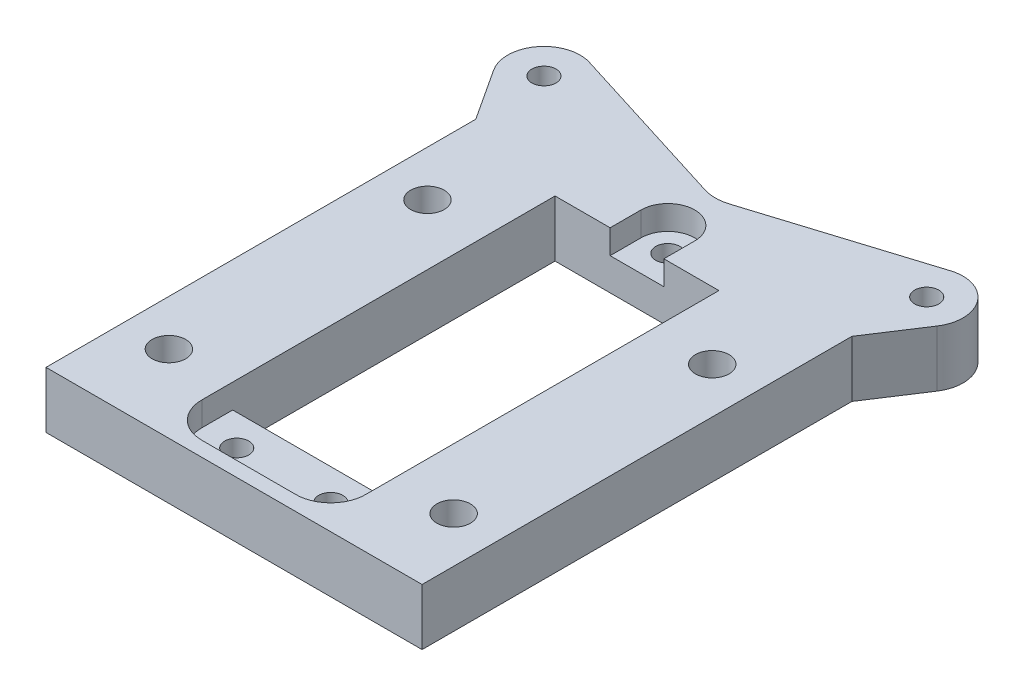
ISO-10303-21;
HEADER;
FILE_DESCRIPTION(('STEP AP214'),'2;1');
FILE_NAME('part.step','',(''),(''),'','','');
FILE_SCHEMA(('AUTOMOTIVE_DESIGN { 1 0 10303 214 1 1 1 1 }'));
ENDSEC;
DATA;
#1=APPLICATION_CONTEXT('core data for automotive mechanical design processes');
#2=APPLICATION_PROTOCOL_DEFINITION('international standard','automotive_design',2000,#1);
#3=PRODUCT_CONTEXT('',#1,'mechanical');
#4=PRODUCT('Part','Part','',(#3));
#5=PRODUCT_RELATED_PRODUCT_CATEGORY('part','',(#4));
#6=PRODUCT_DEFINITION_FORMATION('','',#4);
#7=PRODUCT_DEFINITION_CONTEXT('part definition',#1,'design');
#8=PRODUCT_DEFINITION('design','',#6,#7);
#9=PRODUCT_DEFINITION_SHAPE('','',#8);
#10=(LENGTH_UNIT() NAMED_UNIT(*) SI_UNIT(.MILLI.,.METRE.));
#11=(NAMED_UNIT(*) PLANE_ANGLE_UNIT() SI_UNIT($,.RADIAN.));
#12=(NAMED_UNIT(*) SI_UNIT($,.STERADIAN.) SOLID_ANGLE_UNIT());
#13=UNCERTAINTY_MEASURE_WITH_UNIT(LENGTH_MEASURE(1.E-05),#10,'distance_accuracy_value','');
#14=(GEOMETRIC_REPRESENTATION_CONTEXT(3) GLOBAL_UNCERTAINTY_ASSIGNED_CONTEXT((#13)) GLOBAL_UNIT_ASSIGNED_CONTEXT((#10,
#11,#12)) REPRESENTATION_CONTEXT('',''));
#15=CARTESIAN_POINT('',(0.,0.,0.));
#16=DIRECTION('',(0.,0.,1.));
#17=DIRECTION('',(1.,0.,0.));
#18=AXIS2_PLACEMENT_3D('',#15,#16,#17);
#19=CARTESIAN_POINT('',(-6.1,4.2,12.));
#20=DIRECTION('',(0.,0.,-1.));
#21=DIRECTION('',(-1.,0.,0.));
#22=AXIS2_PLACEMENT_3D('',#19,#20,#21);
#23=PLANE('',#22);
#24=DIRECTION('',(0.,-1.,0.));
#25=VECTOR('',#24,1.);
#26=CARTESIAN_POINT('',(-6.1,4.2,12.));
#27=LINE('',#26,#25);
#28=CARTESIAN_POINT('',(-6.1,2.4,12.));
#29=VERTEX_POINT('',#28);
#30=CARTESIAN_POINT('',(-6.1,0.,12.));
#31=VERTEX_POINT('',#30);
#32=EDGE_CURVE('E313',#29,#31,#27,.T.);
#33=ORIENTED_EDGE('',*,*,#32,.F.);
#34=DIRECTION('',(-1.,0.,0.));
#35=VECTOR('',#34,1.);
#36=CARTESIAN_POINT('',(6.10000000000001,2.4,12.));
#37=LINE('',#36,#35);
#38=CARTESIAN_POINT('',(6.10000000000001,2.4,12.));
#39=VERTEX_POINT('',#38);
#40=EDGE_CURVE('E61',#39,#29,#37,.T.);
#41=ORIENTED_EDGE('',*,*,#40,.F.);
#42=DIRECTION('',(0.,-1.,0.));
#43=VECTOR('',#42,1.);
#44=CARTESIAN_POINT('',(6.10000000000001,4.2,12.));
#45=LINE('',#44,#43);
#46=CARTESIAN_POINT('',(6.10000000000001,0.,12.));
#47=VERTEX_POINT('',#46);
#48=EDGE_CURVE('E329',#39,#47,#45,.T.);
#49=ORIENTED_EDGE('',*,*,#48,.T.);
#50=DIRECTION('',(1.,0.,0.));
#51=VECTOR('',#50,1.);
#52=CARTESIAN_POINT('',(-6.1,0.,12.));
#53=LINE('',#52,#51);
#54=EDGE_CURVE('E301',#31,#47,#53,.T.);
#55=ORIENTED_EDGE('',*,*,#54,.F.);
#56=EDGE_LOOP('',(#33,#41,#49,#55));
#57=FACE_BOUND('',#56,.T.);
#58=ADVANCED_FACE('F36',(#57),#23,.T.);
#59=CARTESIAN_POINT('',(-3.5,4.2,14.3));
#60=DIRECTION('',(0.,-1.,0.));
#61=DIRECTION('',(0.,0.,-1.));
#62=AXIS2_PLACEMENT_3D('',#59,#60,#61);
#63=CYLINDRICAL_SURFACE('',#62,0.9);
#64=CARTESIAN_POINT('',(-3.5,0.,14.3));
#65=DIRECTION('',(0.,1.,0.));
#66=DIRECTION('',(0.,0.,1.));
#67=AXIS2_PLACEMENT_3D('',#64,#65,#66);
#68=CIRCLE('',#67,0.9);
#69=CARTESIAN_POINT('',(-3.5,0.,15.2));
#70=VERTEX_POINT('',#69);
#71=EDGE_CURVE('E288',#70,#70,#68,.T.);
#72=ORIENTED_EDGE('',*,*,#71,.F.);
#73=EDGE_LOOP('',(#72));
#74=FACE_BOUND('',#73,.T.);
#75=CARTESIAN_POINT('',(-3.5,2.4,14.3));
#76=DIRECTION('',(0.,1.,0.));
#77=DIRECTION('',(0.,0.,1.));
#78=AXIS2_PLACEMENT_3D('',#75,#76,#77);
#79=CIRCLE('',#78,0.9);
#80=CARTESIAN_POINT('',(-3.5,2.4,15.2));
#81=VERTEX_POINT('',#80);
#82=EDGE_CURVE('E255',#81,#81,#79,.T.);
#83=ORIENTED_EDGE('',*,*,#82,.T.);
#84=EDGE_LOOP('',(#83));
#85=FACE_BOUND('',#84,.T.);
#86=ADVANCED_FACE('F423',(#74,#85),#63,.F.);
#87=CARTESIAN_POINT('',(3.5,4.2,14.3));
#88=DIRECTION('',(0.,-1.,0.));
#89=DIRECTION('',(0.,0.,-1.));
#90=AXIS2_PLACEMENT_3D('',#87,#88,#89);
#91=CYLINDRICAL_SURFACE('',#90,0.899999999999999);
#92=CARTESIAN_POINT('',(3.5,0.,14.3));
#93=DIRECTION('',(0.,1.,0.));
#94=DIRECTION('',(0.,0.,1.));
#95=AXIS2_PLACEMENT_3D('',#92,#93,#94);
#96=CIRCLE('',#95,0.899999999999999);
#97=CARTESIAN_POINT('',(3.5,0.,15.2));
#98=VERTEX_POINT('',#97);
#99=EDGE_CURVE('E283',#98,#98,#96,.T.);
#100=ORIENTED_EDGE('',*,*,#99,.F.);
#101=EDGE_LOOP('',(#100));
#102=FACE_BOUND('',#101,.T.);
#103=CARTESIAN_POINT('',(3.5,2.4,14.3));
#104=DIRECTION('',(0.,1.,0.));
#105=DIRECTION('',(0.,0.,1.));
#106=AXIS2_PLACEMENT_3D('',#103,#104,#105);
#107=CIRCLE('',#106,0.899999999999999);
#108=CARTESIAN_POINT('',(3.5,2.4,15.2));
#109=VERTEX_POINT('',#108);
#110=EDGE_CURVE('E40',#109,#109,#107,.T.);
#111=ORIENTED_EDGE('',*,*,#110,.T.);
#112=EDGE_LOOP('',(#111));
#113=FACE_BOUND('',#112,.T.);
#114=ADVANCED_FACE('F406',(#102,#113),#91,.F.);
#115=CARTESIAN_POINT('',(14.25,4.2,-19.3204851234516));
#116=DIRECTION('',(0.,1.,0.));
#117=DIRECTION('',(0.,0.,1.));
#118=AXIS2_PLACEMENT_3D('',#115,#116,#117);
#119=PLANE('',#118);
#120=DIRECTION('',(0.,0.,-1.));
#121=VECTOR('',#120,1.);
#122=CARTESIAN_POINT('',(2.,4.2,-12.));
#123=LINE('',#122,#121);
#124=CARTESIAN_POINT('',(2.,4.2,-12.));
#125=VERTEX_POINT('',#124);
#126=CARTESIAN_POINT('',(2.,4.2,-14.3));
#127=VERTEX_POINT('',#126);
#128=EDGE_CURVE('E206',#125,#127,#123,.T.);
#129=ORIENTED_EDGE('',*,*,#128,.F.);
#130=DIRECTION('',(-1.,0.,0.));
#131=VECTOR('',#130,1.);
#132=CARTESIAN_POINT('',(6.1,4.2,-12.));
#133=LINE('',#132,#131);
#134=CARTESIAN_POINT('',(6.1,4.2,-12.));
#135=VERTEX_POINT('',#134);
#136=EDGE_CURVE('E308',#135,#125,#133,.T.);
#137=ORIENTED_EDGE('',*,*,#136,.F.);
#138=DIRECTION('',(0.,0.,-1.));
#139=VECTOR('',#138,1.);
#140=CARTESIAN_POINT('',(6.10000000000001,4.2,12.));
#141=LINE('',#140,#139);
#142=CARTESIAN_POINT('',(6.1,4.2,14.3));
#143=VERTEX_POINT('',#142);
#144=EDGE_CURVE('E304',#143,#135,#141,.T.);
#145=ORIENTED_EDGE('',*,*,#144,.F.);
#146=CARTESIAN_POINT('',(3.5,4.2,14.3));
#147=DIRECTION('',(0.,1.,0.));
#148=DIRECTION('',(0.,0.,-1.));
#149=AXIS2_PLACEMENT_3D('',#146,#147,#148);
#150=CIRCLE('',#149,2.6);
#151=CARTESIAN_POINT('',(3.5,4.2,16.9));
#152=VERTEX_POINT('',#151);
#153=EDGE_CURVE('E225',#152,#143,#150,.T.);
#154=ORIENTED_EDGE('',*,*,#153,.F.);
#155=DIRECTION('',(1.,0.,0.));
#156=VECTOR('',#155,1.);
#157=CARTESIAN_POINT('',(-3.5,4.2,16.9));
#158=LINE('',#157,#156);
#159=CARTESIAN_POINT('',(-3.5,4.2,16.9));
#160=VERTEX_POINT('',#159);
#161=EDGE_CURVE('E242',#160,#152,#158,.T.);
#162=ORIENTED_EDGE('',*,*,#161,.F.);
#163=CARTESIAN_POINT('',(-3.5,4.2,14.3));
#164=DIRECTION('',(0.,1.,0.));
#165=DIRECTION('',(0.,0.,1.));
#166=AXIS2_PLACEMENT_3D('',#163,#164,#165);
#167=CIRCLE('',#166,2.6);
#168=CARTESIAN_POINT('',(-6.1,4.2,14.3));
#169=VERTEX_POINT('',#168);
#170=EDGE_CURVE('E239',#169,#160,#167,.T.);
#171=ORIENTED_EDGE('',*,*,#170,.F.);
#172=DIRECTION('',(0.,0.,1.));
#173=VECTOR('',#172,1.);
#174=CARTESIAN_POINT('',(-6.09999999999999,4.2,-12.));
#175=LINE('',#174,#173);
#176=CARTESIAN_POINT('',(-6.09999999999999,4.2,-12.));
#177=VERTEX_POINT('',#176);
#178=EDGE_CURVE('E311',#177,#169,#175,.T.);
#179=ORIENTED_EDGE('',*,*,#178,.F.);
#180=CARTESIAN_POINT('',(-2.,4.2,-12.));
#181=VERTEX_POINT('',#180);
#182=EDGE_CURVE('E306',#181,#177,#133,.T.);
#183=ORIENTED_EDGE('',*,*,#182,.F.);
#184=DIRECTION('',(0.,0.,1.));
#185=VECTOR('',#184,1.);
#186=CARTESIAN_POINT('',(-2.,4.2,-14.3));
#187=LINE('',#186,#185);
#188=CARTESIAN_POINT('',(-2.,4.2,-14.3));
#189=VERTEX_POINT('',#188);
#190=EDGE_CURVE('E209',#189,#181,#187,.T.);
#191=ORIENTED_EDGE('',*,*,#190,.F.);
#192=CARTESIAN_POINT('',(0.,4.2,-14.3));
#193=DIRECTION('',(0.,1.,0.));
#194=DIRECTION('',(0.,0.,-1.));
#195=AXIS2_PLACEMENT_3D('',#192,#193,#194);
#196=CIRCLE('',#195,2.);
#197=EDGE_CURVE('E193',#127,#189,#196,.T.);
#198=ORIENTED_EDGE('',*,*,#197,.F.);
#199=EDGE_LOOP('',(#129,#137,#145,#154,#162,#171,#179,#183,#191,#198));
#200=FACE_BOUND('',#199,.T.);
#201=CARTESIAN_POINT('',(-14.25,4.2,-19.3204851234516));
#202=DIRECTION('',(0.,1.,0.));
#203=DIRECTION('',(0.,0.,1.));
#204=AXIS2_PLACEMENT_3D('',#201,#202,#203);
#205=CIRCLE('',#204,0.900000000000001);
#206=CARTESIAN_POINT('',(-14.25,4.2,-18.4204851234516));
#207=VERTEX_POINT('',#206);
#208=EDGE_CURVE('E265',#207,#207,#205,.T.);
#209=ORIENTED_EDGE('',*,*,#208,.F.);
#210=EDGE_LOOP('',(#209));
#211=FACE_BOUND('',#210,.T.);
#212=CARTESIAN_POINT('',(10.6,4.2,-7.));
#213=DIRECTION('',(0.,1.,0.));
#214=DIRECTION('',(0.,0.,1.));
#215=AXIS2_PLACEMENT_3D('',#212,#213,#214);
#216=CIRCLE('',#215,1.25);
#217=CARTESIAN_POINT('',(10.6,4.2,-5.75));
#218=VERTEX_POINT('',#217);
#219=EDGE_CURVE('E274',#218,#218,#216,.T.);
#220=ORIENTED_EDGE('',*,*,#219,.F.);
#221=EDGE_LOOP('',(#220));
#222=FACE_BOUND('',#221,.T.);
#223=CARTESIAN_POINT('',(-10.6,4.2,12.25));
#224=DIRECTION('',(0.,1.,0.));
#225=DIRECTION('',(0.,0.,1.));
#226=AXIS2_PLACEMENT_3D('',#223,#224,#225);
#227=CIRCLE('',#226,1.25);
#228=CARTESIAN_POINT('',(-10.6,4.2,13.5));
#229=VERTEX_POINT('',#228);
#230=EDGE_CURVE('E292',#229,#229,#227,.T.);
#231=ORIENTED_EDGE('',*,*,#230,.F.);
#232=EDGE_LOOP('',(#231));
#233=FACE_BOUND('',#232,.T.);
#234=DIRECTION('',(1.,0.,0.));
#235=VECTOR('',#234,1.);
#236=CARTESIAN_POINT('',(-14.,4.2,18.));
#237=LINE('',#236,#235);
#238=CARTESIAN_POINT('',(-14.,4.2,18.));
#239=VERTEX_POINT('',#238);
#240=CARTESIAN_POINT('',(14.,4.2,18.));
#241=VERTEX_POINT('',#240);
#242=EDGE_CURVE('E332',#239,#241,#237,.T.);
#243=ORIENTED_EDGE('',*,*,#242,.T.);
#244=DIRECTION('',(0.,0.,-1.));
#245=VECTOR('',#244,1.);
#246=CARTESIAN_POINT('',(14.,4.2,18.));
#247=LINE('',#246,#245);
#248=CARTESIAN_POINT('',(14.,4.2,-14.));
#249=VERTEX_POINT('',#248);
#250=EDGE_CURVE('E335',#241,#249,#247,.T.);
#251=ORIENTED_EDGE('',*,*,#250,.T.);
#252=DIRECTION('',(0.546813594421689,0.,-0.837254377686753));
#253=VECTOR('',#252,1.);
#254=CARTESIAN_POINT('',(14.,4.2,-14.));
#255=LINE('',#254,#253);
#256=CARTESIAN_POINT('',(16.5105868197542,4.2,-17.844088418513));
#257=VERTEX_POINT('',#256);
#258=EDGE_CURVE('E338',#249,#257,#255,.T.);
#259=ORIENTED_EDGE('',*,*,#258,.T.);
#260=CARTESIAN_POINT('',(14.25,4.2,-19.3204851234516));
#261=DIRECTION('',(0.,1.,0.));
#262=DIRECTION('',(0.,0.,1.));
#263=AXIS2_PLACEMENT_3D('',#260,#261,#262);
#264=CIRCLE('',#263,2.7);
#265=CARTESIAN_POINT('',(13.3796995546005,4.2,-21.8763757969229));
#266=VERTEX_POINT('',#265);
#267=EDGE_CURVE('E340',#257,#266,#264,.T.);
#268=ORIENTED_EDGE('',*,*,#267,.T.);
#269=DIRECTION('',(-0.954392340765674,0.,0.298555287824245));
#270=VECTOR('',#269,1.);
#271=CARTESIAN_POINT('',(13.3796995546005,4.2,-21.8763757969229));
#272=LINE('',#271,#270);
#273=CARTESIAN_POINT('',(0.895665863472729,4.2,-17.9710906089969));
#274=VERTEX_POINT('',#273);
#275=EDGE_CURVE('E342',#266,#274,#272,.T.);
#276=ORIENTED_EDGE('',*,*,#275,.T.);
#277=CARTESIAN_POINT('',(0.,4.2,-20.8342676312939));
#278=DIRECTION('',(0.,1.,0.));
#279=DIRECTION('',(0.,0.,1.));
#280=AXIS2_PLACEMENT_3D('',#277,#278,#279);
#281=CIRCLE('',#280,3.);
#282=CARTESIAN_POINT('',(-0.895665863472739,4.2,-17.9710906089969));
#283=VERTEX_POINT('',#282);
#284=EDGE_CURVE('E11',#274,#283,#281,.F.);
#285=ORIENTED_EDGE('',*,*,#284,.T.);
#286=DIRECTION('',(-0.954392340765674,0.,-0.298555287824245));
#287=VECTOR('',#286,1.);
#288=CARTESIAN_POINT('',(0.,4.2,-17.690906277835));
#289=LINE('',#288,#287);
#290=CARTESIAN_POINT('',(-13.3796995546005,4.2,-21.8763757969229));
#291=VERTEX_POINT('',#290);
#292=EDGE_CURVE('E345',#283,#291,#289,.T.);
#293=ORIENTED_EDGE('',*,*,#292,.T.);
#294=CARTESIAN_POINT('',(-14.25,4.2,-19.3204851234516));
#295=DIRECTION('',(0.,1.,0.));
#296=DIRECTION('',(0.,0.,1.));
#297=AXIS2_PLACEMENT_3D('',#294,#295,#296);
#298=CIRCLE('',#297,2.7);
#299=CARTESIAN_POINT('',(-16.5105868197542,4.2,-17.844088418513));
#300=VERTEX_POINT('',#299);
#301=EDGE_CURVE('E347',#291,#300,#298,.T.);
#302=ORIENTED_EDGE('',*,*,#301,.T.);
#303=DIRECTION('',(0.546813594421689,0.,0.837254377686753));
#304=VECTOR('',#303,1.);
#305=CARTESIAN_POINT('',(-16.5105868197542,4.2,-17.844088418513));
#306=LINE('',#305,#304);
#307=CARTESIAN_POINT('',(-14.,4.2,-14.));
#308=VERTEX_POINT('',#307);
#309=EDGE_CURVE('E349',#300,#308,#306,.T.);
#310=ORIENTED_EDGE('',*,*,#309,.T.);
#311=DIRECTION('',(0.,0.,1.));
#312=VECTOR('',#311,1.);
#313=CARTESIAN_POINT('',(-14.,4.2,-14.));
#314=LINE('',#313,#312);
#315=EDGE_CURVE('E351',#308,#239,#314,.T.);
#316=ORIENTED_EDGE('',*,*,#315,.T.);
#317=EDGE_LOOP('',(#243,#251,#259,#268,#276,#285,#293,#302,#310,#316));
#318=FACE_BOUND('',#317,.T.);
#319=CARTESIAN_POINT('',(-10.6,4.2,-7.));
#320=DIRECTION('',(0.,1.,0.));
#321=DIRECTION('',(0.,0.,1.));
#322=AXIS2_PLACEMENT_3D('',#319,#320,#321);
#323=CIRCLE('',#322,1.25);
#324=CARTESIAN_POINT('',(-10.6,4.2,-5.75));
#325=VERTEX_POINT('',#324);
#326=EDGE_CURVE('E298',#325,#325,#323,.T.);
#327=ORIENTED_EDGE('',*,*,#326,.F.);
#328=EDGE_LOOP('',(#327));
#329=FACE_BOUND('',#328,.T.);
#330=CARTESIAN_POINT('',(10.6,4.2,12.25));
#331=DIRECTION('',(0.,1.,0.));
#332=DIRECTION('',(0.,0.,1.));
#333=AXIS2_PLACEMENT_3D('',#330,#331,#332);
#334=CIRCLE('',#333,1.25);
#335=CARTESIAN_POINT('',(10.6,4.2,13.5));
#336=VERTEX_POINT('',#335);
#337=EDGE_CURVE('E280',#336,#336,#334,.T.);
#338=ORIENTED_EDGE('',*,*,#337,.F.);
#339=EDGE_LOOP('',(#338));
#340=FACE_BOUND('',#339,.T.);
#341=CARTESIAN_POINT('',(14.25,4.2,-19.3204851234516));
#342=DIRECTION('',(0.,1.,0.));
#343=DIRECTION('',(0.,0.,1.));
#344=AXIS2_PLACEMENT_3D('',#341,#342,#343);
#345=CIRCLE('',#344,0.900000000000001);
#346=CARTESIAN_POINT('',(14.25,4.2,-18.4204851234516));
#347=VERTEX_POINT('',#346);
#348=EDGE_CURVE('E259',#347,#347,#345,.T.);
#349=ORIENTED_EDGE('',*,*,#348,.F.);
#350=EDGE_LOOP('',(#349));
#351=FACE_BOUND('',#350,.T.);
#352=ADVANCED_FACE('F436',(#200,#211,#222,#233,#318,#329,#340,#351),#119,.T.);
#353=CARTESIAN_POINT('',(14.25,0.,-19.3204851234516));
#354=DIRECTION('',(0.,1.,0.));
#355=DIRECTION('',(0.,0.,1.));
#356=AXIS2_PLACEMENT_3D('',#353,#354,#355);
#357=PLANE('',#356);
#358=DIRECTION('',(1.,0.,0.));
#359=VECTOR('',#358,1.);
#360=CARTESIAN_POINT('',(-14.,0.,18.));
#361=LINE('',#360,#359);
#362=CARTESIAN_POINT('',(-14.,0.,18.));
#363=VERTEX_POINT('',#362);
#364=CARTESIAN_POINT('',(14.,0.,18.));
#365=VERTEX_POINT('',#364);
#366=EDGE_CURVE('E331',#363,#365,#361,.T.);
#367=ORIENTED_EDGE('',*,*,#366,.F.);
#368=DIRECTION('',(0.,0.,1.));
#369=VECTOR('',#368,1.);
#370=CARTESIAN_POINT('',(-14.,0.,-14.));
#371=LINE('',#370,#369);
#372=CARTESIAN_POINT('',(-14.,0.,-14.));
#373=VERTEX_POINT('',#372);
#374=EDGE_CURVE('E336',#373,#363,#371,.T.);
#375=ORIENTED_EDGE('',*,*,#374,.F.);
#376=DIRECTION('',(0.546813594421689,0.,0.837254377686753));
#377=VECTOR('',#376,1.);
#378=CARTESIAN_POINT('',(-16.5105868197542,0.,-17.844088418513));
#379=LINE('',#378,#377);
#380=CARTESIAN_POINT('',(-16.5105868197542,0.,-17.844088418513));
#381=VERTEX_POINT('',#380);
#382=EDGE_CURVE('E369',#381,#373,#379,.T.);
#383=ORIENTED_EDGE('',*,*,#382,.F.);
#384=CARTESIAN_POINT('',(-14.25,0.,-19.3204851234516));
#385=DIRECTION('',(0.,1.,0.));
#386=DIRECTION('',(0.,0.,1.));
#387=AXIS2_PLACEMENT_3D('',#384,#385,#386);
#388=CIRCLE('',#387,2.7);
#389=CARTESIAN_POINT('',(-13.3796995546005,0.,-21.8763757969229));
#390=VERTEX_POINT('',#389);
#391=EDGE_CURVE('E367',#390,#381,#388,.T.);
#392=ORIENTED_EDGE('',*,*,#391,.F.);
#393=DIRECTION('',(-0.954392340765674,0.,-0.298555287824245));
#394=VECTOR('',#393,1.);
#395=CARTESIAN_POINT('',(0.,0.,-17.690906277835));
#396=LINE('',#395,#394);
#397=CARTESIAN_POINT('',(-0.895665863472739,0.,-17.9710906089969));
#398=VERTEX_POINT('',#397);
#399=EDGE_CURVE('E365',#398,#390,#396,.T.);
#400=ORIENTED_EDGE('',*,*,#399,.F.);
#401=CARTESIAN_POINT('',(0.,0.,-20.8342676312939));
#402=DIRECTION('',(0.,1.,0.));
#403=DIRECTION('',(0.,0.,1.));
#404=AXIS2_PLACEMENT_3D('',#401,#402,#403);
#405=CIRCLE('',#404,3.);
#406=CARTESIAN_POINT('',(0.895665863472729,0.,-17.9710906089969));
#407=VERTEX_POINT('',#406);
#408=EDGE_CURVE('E45',#398,#407,#405,.T.);
#409=ORIENTED_EDGE('',*,*,#408,.T.);
#410=DIRECTION('',(-0.954392340765674,0.,0.298555287824245));
#411=VECTOR('',#410,1.);
#412=CARTESIAN_POINT('',(13.3796995546005,0.,-21.8763757969229));
#413=LINE('',#412,#411);
#414=CARTESIAN_POINT('',(13.3796995546005,0.,-21.8763757969229));
#415=VERTEX_POINT('',#414);
#416=EDGE_CURVE('E362',#415,#407,#413,.T.);
#417=ORIENTED_EDGE('',*,*,#416,.F.);
#418=CARTESIAN_POINT('',(14.25,0.,-19.3204851234516));
#419=DIRECTION('',(0.,1.,0.));
#420=DIRECTION('',(0.,0.,1.));
#421=AXIS2_PLACEMENT_3D('',#418,#419,#420);
#422=CIRCLE('',#421,2.7);
#423=CARTESIAN_POINT('',(16.5105868197542,0.,-17.844088418513));
#424=VERTEX_POINT('',#423);
#425=EDGE_CURVE('E360',#424,#415,#422,.T.);
#426=ORIENTED_EDGE('',*,*,#425,.F.);
#427=DIRECTION('',(0.546813594421689,0.,-0.837254377686753));
#428=VECTOR('',#427,1.);
#429=CARTESIAN_POINT('',(14.,0.,-14.));
#430=LINE('',#429,#428);
#431=CARTESIAN_POINT('',(14.,0.,-14.));
#432=VERTEX_POINT('',#431);
#433=EDGE_CURVE('E358',#432,#424,#430,.T.);
#434=ORIENTED_EDGE('',*,*,#433,.F.);
#435=DIRECTION('',(0.,0.,-1.));
#436=VECTOR('',#435,1.);
#437=CARTESIAN_POINT('',(14.,0.,18.));
#438=LINE('',#437,#436);
#439=EDGE_CURVE('E356',#365,#432,#438,.T.);
#440=ORIENTED_EDGE('',*,*,#439,.F.);
#441=EDGE_LOOP('',(#367,#375,#383,#392,#400,#409,#417,#426,#434,#440));
#442=FACE_BOUND('',#441,.T.);
#443=ORIENTED_EDGE('',*,*,#54,.T.);
#444=DIRECTION('',(0.,0.,-1.));
#445=VECTOR('',#444,1.);
#446=CARTESIAN_POINT('',(6.10000000000001,0.,12.));
#447=LINE('',#446,#445);
#448=CARTESIAN_POINT('',(6.1,0.,-12.));
#449=VERTEX_POINT('',#448);
#450=EDGE_CURVE('E316',#47,#449,#447,.T.);
#451=ORIENTED_EDGE('',*,*,#450,.T.);
#452=DIRECTION('',(-1.,0.,0.));
#453=VECTOR('',#452,1.);
#454=CARTESIAN_POINT('',(6.1,0.,-12.));
#455=LINE('',#454,#453);
#456=CARTESIAN_POINT('',(-6.09999999999999,0.,-12.));
#457=VERTEX_POINT('',#456);
#458=EDGE_CURVE('E319',#449,#457,#455,.T.);
#459=ORIENTED_EDGE('',*,*,#458,.T.);
#460=DIRECTION('',(0.,0.,1.));
#461=VECTOR('',#460,1.);
#462=CARTESIAN_POINT('',(-6.09999999999999,0.,-12.));
#463=LINE('',#462,#461);
#464=EDGE_CURVE('E307',#457,#31,#463,.T.);
#465=ORIENTED_EDGE('',*,*,#464,.T.);
#466=EDGE_LOOP('',(#443,#451,#459,#465));
#467=FACE_BOUND('',#466,.T.);
#468=CARTESIAN_POINT('',(-10.6,0.,-7.));
#469=DIRECTION('',(0.,1.,0.));
#470=DIRECTION('',(0.,0.,1.));
#471=AXIS2_PLACEMENT_3D('',#468,#469,#470);
#472=CIRCLE('',#471,1.25);
#473=CARTESIAN_POINT('',(-10.6,0.,-5.75));
#474=VERTEX_POINT('',#473);
#475=EDGE_CURVE('E295',#474,#474,#472,.T.);
#476=ORIENTED_EDGE('',*,*,#475,.T.);
#477=EDGE_LOOP('',(#476));
#478=FACE_BOUND('',#477,.T.);
#479=CARTESIAN_POINT('',(-10.6,0.,12.25));
#480=DIRECTION('',(0.,1.,0.));
#481=DIRECTION('',(0.,0.,1.));
#482=AXIS2_PLACEMENT_3D('',#479,#480,#481);
#483=CIRCLE('',#482,1.25);
#484=CARTESIAN_POINT('',(-10.6,0.,13.5));
#485=VERTEX_POINT('',#484);
#486=EDGE_CURVE('E291',#485,#485,#483,.T.);
#487=ORIENTED_EDGE('',*,*,#486,.T.);
#488=EDGE_LOOP('',(#487));
#489=FACE_BOUND('',#488,.T.);
#490=ORIENTED_EDGE('',*,*,#71,.T.);
#491=EDGE_LOOP('',(#490));
#492=FACE_BOUND('',#491,.T.);
#493=ORIENTED_EDGE('',*,*,#99,.T.);
#494=EDGE_LOOP('',(#493));
#495=FACE_BOUND('',#494,.T.);
#496=CARTESIAN_POINT('',(10.6,0.,12.25));
#497=DIRECTION('',(0.,1.,0.));
#498=DIRECTION('',(0.,0.,1.));
#499=AXIS2_PLACEMENT_3D('',#496,#497,#498);
#500=CIRCLE('',#499,1.25);
#501=CARTESIAN_POINT('',(10.6,0.,13.5));
#502=VERTEX_POINT('',#501);
#503=EDGE_CURVE('E277',#502,#502,#500,.T.);
#504=ORIENTED_EDGE('',*,*,#503,.T.);
#505=EDGE_LOOP('',(#504));
#506=FACE_BOUND('',#505,.T.);
#507=CARTESIAN_POINT('',(10.6,0.,-7.));
#508=DIRECTION('',(0.,1.,0.));
#509=DIRECTION('',(0.,0.,1.));
#510=AXIS2_PLACEMENT_3D('',#507,#508,#509);
#511=CIRCLE('',#510,1.25);
#512=CARTESIAN_POINT('',(10.6,0.,-5.75));
#513=VERTEX_POINT('',#512);
#514=EDGE_CURVE('E273',#513,#513,#511,.T.);
#515=ORIENTED_EDGE('',*,*,#514,.T.);
#516=EDGE_LOOP('',(#515));
#517=FACE_BOUND('',#516,.T.);
#518=CARTESIAN_POINT('',(0.,0.,-14.3));
#519=DIRECTION('',(0.,1.,0.));
#520=DIRECTION('',(0.,0.,1.));
#521=AXIS2_PLACEMENT_3D('',#518,#519,#520);
#522=CIRCLE('',#521,0.9);
#523=CARTESIAN_POINT('',(0.,0.,-13.4));
#524=VERTEX_POINT('',#523);
#525=EDGE_CURVE('E268',#524,#524,#522,.T.);
#526=ORIENTED_EDGE('',*,*,#525,.T.);
#527=EDGE_LOOP('',(#526));
#528=FACE_BOUND('',#527,.T.);
#529=CARTESIAN_POINT('',(-14.25,0.,-19.3204851234516));
#530=DIRECTION('',(0.,1.,0.));
#531=DIRECTION('',(0.,0.,1.));
#532=AXIS2_PLACEMENT_3D('',#529,#530,#531);
#533=CIRCLE('',#532,0.900000000000001);
#534=CARTESIAN_POINT('',(-14.25,0.,-18.4204851234516));
#535=VERTEX_POINT('',#534);
#536=EDGE_CURVE('E262',#535,#535,#533,.T.);
#537=ORIENTED_EDGE('',*,*,#536,.T.);
#538=EDGE_LOOP('',(#537));
#539=FACE_BOUND('',#538,.T.);
#540=CARTESIAN_POINT('',(14.25,0.,-19.3204851234516));
#541=DIRECTION('',(0.,1.,0.));
#542=DIRECTION('',(0.,0.,1.));
#543=AXIS2_PLACEMENT_3D('',#540,#541,#542);
#544=CIRCLE('',#543,0.900000000000001);
#545=CARTESIAN_POINT('',(14.25,0.,-18.4204851234516));
#546=VERTEX_POINT('',#545);
#547=EDGE_CURVE('E258',#546,#546,#544,.T.);
#548=ORIENTED_EDGE('',*,*,#547,.T.);
#549=EDGE_LOOP('',(#548));
#550=FACE_BOUND('',#549,.T.);
#551=ADVANCED_FACE('F439',(#442,#467,#478,#489,#492,#495,#506,#517,#528,#539,#550),#357,.F.);
#552=CARTESIAN_POINT('',(-14.,4.2,18.));
#553=DIRECTION('',(0.,0.,-1.));
#554=DIRECTION('',(-1.,0.,0.));
#555=AXIS2_PLACEMENT_3D('',#552,#553,#554);
#556=PLANE('',#555);
#557=ORIENTED_EDGE('',*,*,#366,.T.);
#558=DIRECTION('',(0.,-1.,0.));
#559=VECTOR('',#558,1.);
#560=CARTESIAN_POINT('',(14.,4.2,18.));
#561=LINE('',#560,#559);
#562=EDGE_CURVE('E392',#241,#365,#561,.T.);
#563=ORIENTED_EDGE('',*,*,#562,.F.);
#564=ORIENTED_EDGE('',*,*,#242,.F.);
#565=DIRECTION('',(0.,-1.,0.));
#566=VECTOR('',#565,1.);
#567=CARTESIAN_POINT('',(-14.,4.2,18.));
#568=LINE('',#567,#566);
#569=EDGE_CURVE('E353',#239,#363,#568,.T.);
#570=ORIENTED_EDGE('',*,*,#569,.T.);
#571=EDGE_LOOP('',(#557,#563,#564,#570));
#572=FACE_BOUND('',#571,.T.);
#573=ADVANCED_FACE('F443',(#572),#556,.F.);
#574=CARTESIAN_POINT('',(14.,4.2,18.));
#575=DIRECTION('',(-1.,0.,0.));
#576=DIRECTION('',(0.,0.,1.));
#577=AXIS2_PLACEMENT_3D('',#574,#575,#576);
#578=PLANE('',#577);
#579=ORIENTED_EDGE('',*,*,#439,.T.);
#580=DIRECTION('',(0.,-1.,0.));
#581=VECTOR('',#580,1.);
#582=CARTESIAN_POINT('',(14.,4.2,-14.));
#583=LINE('',#582,#581);
#584=EDGE_CURVE('E389',#249,#432,#583,.T.);
#585=ORIENTED_EDGE('',*,*,#584,.F.);
#586=ORIENTED_EDGE('',*,*,#250,.F.);
#587=ORIENTED_EDGE('',*,*,#562,.T.);
#588=EDGE_LOOP('',(#579,#585,#586,#587));
#589=FACE_BOUND('',#588,.T.);
#590=ADVANCED_FACE('F472',(#589),#578,.F.);
#591=CARTESIAN_POINT('',(14.,4.2,-14.));
#592=DIRECTION('',(-0.837254377686754,0.,-0.546813594421689));
#593=DIRECTION('',(-0.546813594421689,0.,0.837254377686754));
#594=AXIS2_PLACEMENT_3D('',#591,#592,#593);
#595=PLANE('',#594);
#596=ORIENTED_EDGE('',*,*,#433,.T.);
#597=DIRECTION('',(0.,-1.,0.));
#598=VECTOR('',#597,1.);
#599=CARTESIAN_POINT('',(16.5105868197542,4.2,-17.844088418513));
#600=LINE('',#599,#598);
#601=EDGE_CURVE('E386',#257,#424,#600,.T.);
#602=ORIENTED_EDGE('',*,*,#601,.F.);
#603=ORIENTED_EDGE('',*,*,#258,.F.);
#604=ORIENTED_EDGE('',*,*,#584,.T.);
#605=EDGE_LOOP('',(#596,#602,#603,#604));
#606=FACE_BOUND('',#605,.T.);
#607=ADVANCED_FACE('F468',(#606),#595,.F.);
#608=CARTESIAN_POINT('',(14.25,4.2,-19.3204851234516));
#609=DIRECTION('',(0.,-1.,0.));
#610=DIRECTION('',(0.,0.,-1.));
#611=AXIS2_PLACEMENT_3D('',#608,#609,#610);
#612=CYLINDRICAL_SURFACE('',#611,2.7);
#613=ORIENTED_EDGE('',*,*,#425,.T.);
#614=DIRECTION('',(0.,-1.,0.));
#615=VECTOR('',#614,1.);
#616=CARTESIAN_POINT('',(13.3796995546005,4.2,-21.8763757969229));
#617=LINE('',#616,#615);
#618=EDGE_CURVE('E383',#266,#415,#617,.T.);
#619=ORIENTED_EDGE('',*,*,#618,.F.);
#620=ORIENTED_EDGE('',*,*,#267,.F.);
#621=ORIENTED_EDGE('',*,*,#601,.T.);
#622=EDGE_LOOP('',(#613,#619,#620,#621));
#623=FACE_BOUND('',#622,.T.);
#624=ADVANCED_FACE('F464',(#623),#612,.T.);
#625=CARTESIAN_POINT('',(13.3796995546005,4.2,-21.8763757969229));
#626=DIRECTION('',(0.298555287824245,0.,0.954392340765674));
#627=DIRECTION('',(0.954392340765674,0.,-0.298555287824245));
#628=AXIS2_PLACEMENT_3D('',#625,#626,#627);
#629=PLANE('',#628);
#630=ORIENTED_EDGE('',*,*,#416,.T.);
#631=DIRECTION('',(0.,-1.,0.));
#632=VECTOR('',#631,1.);
#633=CARTESIAN_POINT('',(0.89566586347273,4.2,-17.9710906089969));
#634=LINE('',#633,#632);
#635=EDGE_CURVE('E398',#407,#274,#634,.F.);
#636=ORIENTED_EDGE('',*,*,#635,.T.);
#637=ORIENTED_EDGE('',*,*,#275,.F.);
#638=ORIENTED_EDGE('',*,*,#618,.T.);
#639=EDGE_LOOP('',(#630,#636,#637,#638));
#640=FACE_BOUND('',#639,.T.);
#641=ADVANCED_FACE('F460',(#640),#629,.F.);
#642=CARTESIAN_POINT('',(0.,4.2,-17.690906277835));
#643=DIRECTION('',(-0.298555287824245,0.,0.954392340765674));
#644=DIRECTION('',(0.954392340765674,0.,0.298555287824245));
#645=AXIS2_PLACEMENT_3D('',#642,#643,#644);
#646=PLANE('',#645);
#647=ORIENTED_EDGE('',*,*,#292,.F.);
#648=DIRECTION('',(0.,-1.,0.));
#649=VECTOR('',#648,1.);
#650=CARTESIAN_POINT('',(-0.895665863472738,0.,-17.9710906089969));
#651=LINE('',#650,#649);
#652=EDGE_CURVE('E395',#283,#398,#651,.T.);
#653=ORIENTED_EDGE('',*,*,#652,.T.);
#654=ORIENTED_EDGE('',*,*,#399,.T.);
#655=DIRECTION('',(0.,-1.,0.));
#656=VECTOR('',#655,1.);
#657=CARTESIAN_POINT('',(-13.3796995546005,4.2,-21.8763757969229));
#658=LINE('',#657,#656);
#659=EDGE_CURVE('E380',#291,#390,#658,.T.);
#660=ORIENTED_EDGE('',*,*,#659,.F.);
#661=EDGE_LOOP('',(#647,#653,#654,#660));
#662=FACE_BOUND('',#661,.T.);
#663=ADVANCED_FACE('F456',(#662),#646,.F.);
#664=CARTESIAN_POINT('',(-14.25,4.2,-19.3204851234516));
#665=DIRECTION('',(0.,-1.,0.));
#666=DIRECTION('',(0.,0.,-1.));
#667=AXIS2_PLACEMENT_3D('',#664,#665,#666);
#668=CYLINDRICAL_SURFACE('',#667,2.7);
#669=ORIENTED_EDGE('',*,*,#391,.T.);
#670=DIRECTION('',(0.,-1.,0.));
#671=VECTOR('',#670,1.);
#672=CARTESIAN_POINT('',(-16.5105868197542,4.2,-17.844088418513));
#673=LINE('',#672,#671);
#674=EDGE_CURVE('E377',#300,#381,#673,.T.);
#675=ORIENTED_EDGE('',*,*,#674,.F.);
#676=ORIENTED_EDGE('',*,*,#301,.F.);
#677=ORIENTED_EDGE('',*,*,#659,.T.);
#678=EDGE_LOOP('',(#669,#675,#676,#677));
#679=FACE_BOUND('',#678,.T.);
#680=ADVANCED_FACE('F452',(#679),#668,.T.);
#681=CARTESIAN_POINT('',(-16.5105868197542,4.2,-17.844088418513));
#682=DIRECTION('',(0.837254377686753,0.,-0.546813594421689));
#683=DIRECTION('',(-0.546813594421689,0.,-0.837254377686753));
#684=AXIS2_PLACEMENT_3D('',#681,#682,#683);
#685=PLANE('',#684);
#686=ORIENTED_EDGE('',*,*,#382,.T.);
#687=DIRECTION('',(0.,-1.,0.));
#688=VECTOR('',#687,1.);
#689=CARTESIAN_POINT('',(-14.,4.2,-14.));
#690=LINE('',#689,#688);
#691=EDGE_CURVE('E374',#308,#373,#690,.T.);
#692=ORIENTED_EDGE('',*,*,#691,.F.);
#693=ORIENTED_EDGE('',*,*,#309,.F.);
#694=ORIENTED_EDGE('',*,*,#674,.T.);
#695=EDGE_LOOP('',(#686,#692,#693,#694));
#696=FACE_BOUND('',#695,.T.);
#697=ADVANCED_FACE('F448',(#696),#685,.F.);
#698=CARTESIAN_POINT('',(-14.,4.2,-14.));
#699=DIRECTION('',(1.,0.,0.));
#700=DIRECTION('',(0.,0.,-1.));
#701=AXIS2_PLACEMENT_3D('',#698,#699,#700);
#702=PLANE('',#701);
#703=ORIENTED_EDGE('',*,*,#374,.T.);
#704=ORIENTED_EDGE('',*,*,#569,.F.);
#705=ORIENTED_EDGE('',*,*,#315,.F.);
#706=ORIENTED_EDGE('',*,*,#691,.T.);
#707=EDGE_LOOP('',(#703,#704,#705,#706));
#708=FACE_BOUND('',#707,.T.);
#709=ADVANCED_FACE('F445',(#708),#702,.F.);
#710=CARTESIAN_POINT('',(6.10000000000001,4.2,12.));
#711=DIRECTION('',(-1.,0.,0.));
#712=DIRECTION('',(0.,0.,1.));
#713=AXIS2_PLACEMENT_3D('',#710,#711,#712);
#714=PLANE('',#713);
#715=ORIENTED_EDGE('',*,*,#450,.F.);
#716=ORIENTED_EDGE('',*,*,#48,.F.);
#717=DIRECTION('',(0.,0.,-1.));
#718=VECTOR('',#717,1.);
#719=CARTESIAN_POINT('',(6.10000000000001,2.4,14.3));
#720=LINE('',#719,#718);
#721=CARTESIAN_POINT('',(6.1,2.4,14.3));
#722=VERTEX_POINT('',#721);
#723=EDGE_CURVE('E236',#722,#39,#720,.T.);
#724=ORIENTED_EDGE('',*,*,#723,.F.);
#725=DIRECTION('',(0.,1.,0.));
#726=VECTOR('',#725,1.);
#727=CARTESIAN_POINT('',(6.1,2.4,14.3));
#728=LINE('',#727,#726);
#729=EDGE_CURVE('E215',#722,#143,#728,.T.);
#730=ORIENTED_EDGE('',*,*,#729,.T.);
#731=ORIENTED_EDGE('',*,*,#144,.T.);
#732=DIRECTION('',(0.,-1.,0.));
#733=VECTOR('',#732,1.);
#734=CARTESIAN_POINT('',(6.1,4.2,-12.));
#735=LINE('',#734,#733);
#736=EDGE_CURVE('E327',#135,#449,#735,.T.);
#737=ORIENTED_EDGE('',*,*,#736,.T.);
#738=EDGE_LOOP('',(#715,#716,#724,#730,#731,#737));
#739=FACE_BOUND('',#738,.T.);
#740=ADVANCED_FACE('F434',(#739),#714,.T.);
#741=CARTESIAN_POINT('',(6.1,4.2,-12.));
#742=DIRECTION('',(0.,0.,1.));
#743=DIRECTION('',(1.,0.,0.));
#744=AXIS2_PLACEMENT_3D('',#741,#742,#743);
#745=PLANE('',#744);
#746=DIRECTION('',(0.,1.,0.));
#747=VECTOR('',#746,1.);
#748=CARTESIAN_POINT('',(2.,2.4,-12.));
#749=LINE('',#748,#747);
#750=CARTESIAN_POINT('',(2.,2.4,-12.));
#751=VERTEX_POINT('',#750);
#752=EDGE_CURVE('E220',#751,#125,#749,.T.);
#753=ORIENTED_EDGE('',*,*,#752,.F.);
#754=DIRECTION('',(1.,0.,0.));
#755=VECTOR('',#754,1.);
#756=CARTESIAN_POINT('',(-2.,2.4,-12.));
#757=LINE('',#756,#755);
#758=CARTESIAN_POINT('',(-2.,2.4,-12.));
#759=VERTEX_POINT('',#758);
#760=EDGE_CURVE('E202',#759,#751,#757,.T.);
#761=ORIENTED_EDGE('',*,*,#760,.F.);
#762=DIRECTION('',(0.,1.,0.));
#763=VECTOR('',#762,1.);
#764=CARTESIAN_POINT('',(-2.,2.4,-12.));
#765=LINE('',#764,#763);
#766=EDGE_CURVE('E196',#759,#181,#765,.T.);
#767=ORIENTED_EDGE('',*,*,#766,.T.);
#768=ORIENTED_EDGE('',*,*,#182,.T.);
#769=DIRECTION('',(0.,-1.,0.));
#770=VECTOR('',#769,1.);
#771=CARTESIAN_POINT('',(-6.09999999999999,4.2,-12.));
#772=LINE('',#771,#770);
#773=EDGE_CURVE('E325',#177,#457,#772,.T.);
#774=ORIENTED_EDGE('',*,*,#773,.T.);
#775=ORIENTED_EDGE('',*,*,#458,.F.);
#776=ORIENTED_EDGE('',*,*,#736,.F.);
#777=ORIENTED_EDGE('',*,*,#136,.T.);
#778=EDGE_LOOP('',(#753,#761,#767,#768,#774,#775,#776,#777));
#779=FACE_BOUND('',#778,.T.);
#780=ADVANCED_FACE('F554',(#779),#745,.T.);
#781=CARTESIAN_POINT('',(-6.09999999999999,4.2,-12.));
#782=DIRECTION('',(1.,0.,0.));
#783=DIRECTION('',(0.,0.,-1.));
#784=AXIS2_PLACEMENT_3D('',#781,#782,#783);
#785=PLANE('',#784);
#786=ORIENTED_EDGE('',*,*,#464,.F.);
#787=ORIENTED_EDGE('',*,*,#773,.F.);
#788=ORIENTED_EDGE('',*,*,#178,.T.);
#789=DIRECTION('',(0.,1.,0.));
#790=VECTOR('',#789,1.);
#791=CARTESIAN_POINT('',(-6.1,2.4,14.3));
#792=LINE('',#791,#790);
#793=CARTESIAN_POINT('',(-6.1,2.4,14.3));
#794=VERTEX_POINT('',#793);
#795=EDGE_CURVE('E238',#794,#169,#792,.T.);
#796=ORIENTED_EDGE('',*,*,#795,.F.);
#797=DIRECTION('',(0.,0.,1.));
#798=VECTOR('',#797,1.);
#799=CARTESIAN_POINT('',(-6.1,2.4,12.));
#800=LINE('',#799,#798);
#801=EDGE_CURVE('E224',#29,#794,#800,.T.);
#802=ORIENTED_EDGE('',*,*,#801,.F.);
#803=ORIENTED_EDGE('',*,*,#32,.T.);
#804=EDGE_LOOP('',(#786,#787,#788,#796,#802,#803));
#805=FACE_BOUND('',#804,.T.);
#806=ADVANCED_FACE('F551',(#805),#785,.T.);
#807=CARTESIAN_POINT('',(-10.6,4.2,-7.));
#808=DIRECTION('',(0.,-1.,0.));
#809=DIRECTION('',(0.,0.,-1.));
#810=AXIS2_PLACEMENT_3D('',#807,#808,#809);
#811=CYLINDRICAL_SURFACE('',#810,1.25);
#812=ORIENTED_EDGE('',*,*,#326,.T.);
#813=EDGE_LOOP('',(#812));
#814=FACE_BOUND('',#813,.T.);
#815=ORIENTED_EDGE('',*,*,#475,.F.);
#816=EDGE_LOOP('',(#815));
#817=FACE_BOUND('',#816,.T.);
#818=ADVANCED_FACE('F547',(#814,#817),#811,.F.);
#819=CARTESIAN_POINT('',(-10.6,4.2,12.25));
#820=DIRECTION('',(0.,-1.,0.));
#821=DIRECTION('',(0.,0.,-1.));
#822=AXIS2_PLACEMENT_3D('',#819,#820,#821);
#823=CYLINDRICAL_SURFACE('',#822,1.25);
#824=ORIENTED_EDGE('',*,*,#230,.T.);
#825=EDGE_LOOP('',(#824));
#826=FACE_BOUND('',#825,.T.);
#827=ORIENTED_EDGE('',*,*,#486,.F.);
#828=EDGE_LOOP('',(#827));
#829=FACE_BOUND('',#828,.T.);
#830=ADVANCED_FACE('F540',(#826,#829),#823,.F.);
#831=CARTESIAN_POINT('',(10.6,4.2,12.25));
#832=DIRECTION('',(0.,-1.,0.));
#833=DIRECTION('',(0.,0.,-1.));
#834=AXIS2_PLACEMENT_3D('',#831,#832,#833);
#835=CYLINDRICAL_SURFACE('',#834,1.25);
#836=ORIENTED_EDGE('',*,*,#337,.T.);
#837=EDGE_LOOP('',(#836));
#838=FACE_BOUND('',#837,.T.);
#839=ORIENTED_EDGE('',*,*,#503,.F.);
#840=EDGE_LOOP('',(#839));
#841=FACE_BOUND('',#840,.T.);
#842=ADVANCED_FACE('F536',(#838,#841),#835,.F.);
#843=CARTESIAN_POINT('',(10.6,4.2,-7.));
#844=DIRECTION('',(0.,-1.,0.));
#845=DIRECTION('',(0.,0.,-1.));
#846=AXIS2_PLACEMENT_3D('',#843,#844,#845);
#847=CYLINDRICAL_SURFACE('',#846,1.25);
#848=ORIENTED_EDGE('',*,*,#219,.T.);
#849=EDGE_LOOP('',(#848));
#850=FACE_BOUND('',#849,.T.);
#851=ORIENTED_EDGE('',*,*,#514,.F.);
#852=EDGE_LOOP('',(#851));
#853=FACE_BOUND('',#852,.T.);
#854=ADVANCED_FACE('F532',(#850,#853),#847,.F.);
#855=CARTESIAN_POINT('',(0.,4.2,-14.3));
#856=DIRECTION('',(0.,-1.,0.));
#857=DIRECTION('',(0.,0.,-1.));
#858=AXIS2_PLACEMENT_3D('',#855,#856,#857);
#859=CYLINDRICAL_SURFACE('',#858,0.9);
#860=CARTESIAN_POINT('',(0.,2.4,-14.3));
#861=DIRECTION('',(0.,-1.,0.));
#862=DIRECTION('',(0.,0.,-1.));
#863=AXIS2_PLACEMENT_3D('',#860,#861,#862);
#864=CIRCLE('',#863,0.9);
#865=CARTESIAN_POINT('',(0.,2.4,-15.2));
#866=VERTEX_POINT('',#865);
#867=EDGE_CURVE('E219',#866,#866,#864,.T.);
#868=ORIENTED_EDGE('',*,*,#867,.F.);
#869=EDGE_LOOP('',(#868));
#870=FACE_BOUND('',#869,.T.);
#871=ORIENTED_EDGE('',*,*,#525,.F.);
#872=EDGE_LOOP('',(#871));
#873=FACE_BOUND('',#872,.T.);
#874=ADVANCED_FACE('F524',(#870,#873),#859,.F.);
#875=CARTESIAN_POINT('',(-14.25,4.2,-19.3204851234516));
#876=DIRECTION('',(0.,-1.,0.));
#877=DIRECTION('',(0.,0.,-1.));
#878=AXIS2_PLACEMENT_3D('',#875,#876,#877);
#879=CYLINDRICAL_SURFACE('',#878,0.900000000000001);
#880=ORIENTED_EDGE('',*,*,#208,.T.);
#881=EDGE_LOOP('',(#880));
#882=FACE_BOUND('',#881,.T.);
#883=ORIENTED_EDGE('',*,*,#536,.F.);
#884=EDGE_LOOP('',(#883));
#885=FACE_BOUND('',#884,.T.);
#886=ADVANCED_FACE('F518',(#882,#885),#879,.F.);
#887=CARTESIAN_POINT('',(14.25,4.2,-19.3204851234516));
#888=DIRECTION('',(0.,-1.,0.));
#889=DIRECTION('',(0.,0.,-1.));
#890=AXIS2_PLACEMENT_3D('',#887,#888,#889);
#891=CYLINDRICAL_SURFACE('',#890,0.900000000000001);
#892=ORIENTED_EDGE('',*,*,#348,.T.);
#893=EDGE_LOOP('',(#892));
#894=FACE_BOUND('',#893,.T.);
#895=ORIENTED_EDGE('',*,*,#547,.F.);
#896=EDGE_LOOP('',(#895));
#897=FACE_BOUND('',#896,.T.);
#898=ADVANCED_FACE('F512',(#894,#897),#891,.F.);
#899=CARTESIAN_POINT('',(0.,4.2,-20.8342676312939));
#900=DIRECTION('',(0.,1.,0.));
#901=DIRECTION('',(0.,0.,1.));
#902=AXIS2_PLACEMENT_3D('',#899,#900,#901);
#903=CYLINDRICAL_SURFACE('',#902,3.);
#904=ORIENTED_EDGE('',*,*,#284,.F.);
#905=ORIENTED_EDGE('',*,*,#635,.F.);
#906=ORIENTED_EDGE('',*,*,#408,.F.);
#907=ORIENTED_EDGE('',*,*,#652,.F.);
#908=EDGE_LOOP('',(#904,#905,#906,#907));
#909=FACE_BOUND('',#908,.T.);
#910=ADVANCED_FACE('F38',(#909),#903,.F.);
#911=CARTESIAN_POINT('',(0.,2.4,-14.3));
#912=DIRECTION('',(0.,1.,0.));
#913=DIRECTION('',(0.,0.,1.));
#914=AXIS2_PLACEMENT_3D('',#911,#912,#913);
#915=CYLINDRICAL_SURFACE('',#914,2.);
#916=ORIENTED_EDGE('',*,*,#197,.T.);
#917=DIRECTION('',(0.,1.,0.));
#918=VECTOR('',#917,1.);
#919=CARTESIAN_POINT('',(-2.,2.4,-14.3));
#920=LINE('',#919,#918);
#921=CARTESIAN_POINT('',(-2.,2.4,-14.3));
#922=VERTEX_POINT('',#921);
#923=EDGE_CURVE('E188',#922,#189,#920,.T.);
#924=ORIENTED_EDGE('',*,*,#923,.F.);
#925=CARTESIAN_POINT('',(0.,2.4,-14.3));
#926=DIRECTION('',(0.,1.,0.));
#927=DIRECTION('',(0.,0.,-1.));
#928=AXIS2_PLACEMENT_3D('',#925,#926,#927);
#929=CIRCLE('',#928,2.);
#930=CARTESIAN_POINT('',(2.,2.4,-14.3));
#931=VERTEX_POINT('',#930);
#932=EDGE_CURVE('E190',#931,#922,#929,.T.);
#933=ORIENTED_EDGE('',*,*,#932,.F.);
#934=DIRECTION('',(0.,1.,0.));
#935=VECTOR('',#934,1.);
#936=CARTESIAN_POINT('',(2.,2.4,-14.3));
#937=LINE('',#936,#935);
#938=EDGE_CURVE('E217',#931,#127,#937,.T.);
#939=ORIENTED_EDGE('',*,*,#938,.T.);
#940=EDGE_LOOP('',(#916,#924,#933,#939));
#941=FACE_BOUND('',#940,.T.);
#942=ADVANCED_FACE('F189',(#941),#915,.F.);
#943=CARTESIAN_POINT('',(2.,2.4,-12.));
#944=DIRECTION('',(1.,0.,0.));
#945=DIRECTION('',(0.,0.,-1.));
#946=AXIS2_PLACEMENT_3D('',#943,#944,#945);
#947=PLANE('',#946);
#948=ORIENTED_EDGE('',*,*,#128,.T.);
#949=ORIENTED_EDGE('',*,*,#938,.F.);
#950=DIRECTION('',(0.,0.,-1.));
#951=VECTOR('',#950,1.);
#952=CARTESIAN_POINT('',(2.,2.4,-12.));
#953=LINE('',#952,#951);
#954=EDGE_CURVE('E197',#751,#931,#953,.T.);
#955=ORIENTED_EDGE('',*,*,#954,.F.);
#956=ORIENTED_EDGE('',*,*,#752,.T.);
#957=EDGE_LOOP('',(#948,#949,#955,#956));
#958=FACE_BOUND('',#957,.T.);
#959=ADVANCED_FACE('F517',(#958),#947,.F.);
#960=CARTESIAN_POINT('',(-2.,2.4,-14.3));
#961=DIRECTION('',(-1.,0.,0.));
#962=DIRECTION('',(0.,0.,1.));
#963=AXIS2_PLACEMENT_3D('',#960,#961,#962);
#964=PLANE('',#963);
#965=ORIENTED_EDGE('',*,*,#190,.T.);
#966=ORIENTED_EDGE('',*,*,#766,.F.);
#967=DIRECTION('',(0.,0.,1.));
#968=VECTOR('',#967,1.);
#969=CARTESIAN_POINT('',(-2.,2.4,-14.3));
#970=LINE('',#969,#968);
#971=EDGE_CURVE('E53',#922,#759,#970,.T.);
#972=ORIENTED_EDGE('',*,*,#971,.F.);
#973=ORIENTED_EDGE('',*,*,#923,.T.);
#974=EDGE_LOOP('',(#965,#966,#972,#973));
#975=FACE_BOUND('',#974,.T.);
#976=ADVANCED_FACE('F199',(#975),#964,.F.);
#977=CARTESIAN_POINT('',(0.,2.4,-14.3));
#978=DIRECTION('',(0.,-1.,0.));
#979=DIRECTION('',(0.,0.,-1.));
#980=AXIS2_PLACEMENT_3D('',#977,#978,#979);
#981=PLANE('',#980);
#982=ORIENTED_EDGE('',*,*,#867,.T.);
#983=EDGE_LOOP('',(#982));
#984=FACE_BOUND('',#983,.T.);
#985=ORIENTED_EDGE('',*,*,#932,.T.);
#986=ORIENTED_EDGE('',*,*,#971,.T.);
#987=ORIENTED_EDGE('',*,*,#760,.T.);
#988=ORIENTED_EDGE('',*,*,#954,.T.);
#989=EDGE_LOOP('',(#985,#986,#987,#988));
#990=FACE_BOUND('',#989,.T.);
#991=ADVANCED_FACE('F204',(#984,#990),#981,.F.);
#992=CARTESIAN_POINT('',(3.5,2.4,14.3));
#993=DIRECTION('',(0.,1.,0.));
#994=DIRECTION('',(0.,0.,1.));
#995=AXIS2_PLACEMENT_3D('',#992,#993,#994);
#996=CYLINDRICAL_SURFACE('',#995,2.6);
#997=ORIENTED_EDGE('',*,*,#153,.T.);
#998=ORIENTED_EDGE('',*,*,#729,.F.);
#999=CARTESIAN_POINT('',(3.5,2.4,14.3));
#1000=DIRECTION('',(0.,1.,0.));
#1001=DIRECTION('',(0.,0.,-1.));
#1002=AXIS2_PLACEMENT_3D('',#999,#1000,#1001);
#1003=CIRCLE('',#1002,2.6);
#1004=CARTESIAN_POINT('',(3.5,2.4,16.9));
#1005=VERTEX_POINT('',#1004);
#1006=EDGE_CURVE('E233',#1005,#722,#1003,.T.);
#1007=ORIENTED_EDGE('',*,*,#1006,.F.);
#1008=DIRECTION('',(0.,1.,0.));
#1009=VECTOR('',#1008,1.);
#1010=CARTESIAN_POINT('',(3.5,2.4,16.9));
#1011=LINE('',#1010,#1009);
#1012=EDGE_CURVE('E249',#1005,#152,#1011,.T.);
#1013=ORIENTED_EDGE('',*,*,#1012,.T.);
#1014=EDGE_LOOP('',(#997,#998,#1007,#1013));
#1015=FACE_BOUND('',#1014,.T.);
#1016=ADVANCED_FACE('F584',(#1015),#996,.F.);
#1017=CARTESIAN_POINT('',(-3.5,2.4,16.9));
#1018=DIRECTION('',(0.,0.,1.));
#1019=DIRECTION('',(1.,0.,0.));
#1020=AXIS2_PLACEMENT_3D('',#1017,#1018,#1019);
#1021=PLANE('',#1020);
#1022=ORIENTED_EDGE('',*,*,#161,.T.);
#1023=ORIENTED_EDGE('',*,*,#1012,.F.);
#1024=DIRECTION('',(1.,0.,0.));
#1025=VECTOR('',#1024,1.);
#1026=CARTESIAN_POINT('',(-3.5,2.4,16.9));
#1027=LINE('',#1026,#1025);
#1028=CARTESIAN_POINT('',(-3.5,2.4,16.9));
#1029=VERTEX_POINT('',#1028);
#1030=EDGE_CURVE('E230',#1029,#1005,#1027,.T.);
#1031=ORIENTED_EDGE('',*,*,#1030,.F.);
#1032=DIRECTION('',(0.,1.,0.));
#1033=VECTOR('',#1032,1.);
#1034=CARTESIAN_POINT('',(-3.5,2.4,16.9));
#1035=LINE('',#1034,#1033);
#1036=EDGE_CURVE('E251',#1029,#160,#1035,.T.);
#1037=ORIENTED_EDGE('',*,*,#1036,.T.);
#1038=EDGE_LOOP('',(#1022,#1023,#1031,#1037));
#1039=FACE_BOUND('',#1038,.T.);
#1040=ADVANCED_FACE('F416',(#1039),#1021,.F.);
#1041=CARTESIAN_POINT('',(-3.5,2.4,14.3));
#1042=DIRECTION('',(0.,1.,0.));
#1043=DIRECTION('',(0.,0.,1.));
#1044=AXIS2_PLACEMENT_3D('',#1041,#1042,#1043);
#1045=CYLINDRICAL_SURFACE('',#1044,2.6);
#1046=ORIENTED_EDGE('',*,*,#170,.T.);
#1047=ORIENTED_EDGE('',*,*,#1036,.F.);
#1048=CARTESIAN_POINT('',(-3.5,2.4,14.3));
#1049=DIRECTION('',(0.,1.,0.));
#1050=DIRECTION('',(0.,0.,1.));
#1051=AXIS2_PLACEMENT_3D('',#1048,#1049,#1050);
#1052=CIRCLE('',#1051,2.6);
#1053=EDGE_CURVE('E227',#794,#1029,#1052,.T.);
#1054=ORIENTED_EDGE('',*,*,#1053,.F.);
#1055=ORIENTED_EDGE('',*,*,#795,.T.);
#1056=EDGE_LOOP('',(#1046,#1047,#1054,#1055));
#1057=FACE_BOUND('',#1056,.T.);
#1058=ADVANCED_FACE('F410',(#1057),#1045,.F.);
#1059=CARTESIAN_POINT('',(-3.5,2.4,14.3));
#1060=DIRECTION('',(0.,1.,0.));
#1061=DIRECTION('',(0.,0.,1.));
#1062=AXIS2_PLACEMENT_3D('',#1059,#1060,#1061);
#1063=PLANE('',#1062);
#1064=ORIENTED_EDGE('',*,*,#82,.F.);
#1065=EDGE_LOOP('',(#1064));
#1066=FACE_BOUND('',#1065,.T.);
#1067=ORIENTED_EDGE('',*,*,#110,.F.);
#1068=EDGE_LOOP('',(#1067));
#1069=FACE_BOUND('',#1068,.T.);
#1070=ORIENTED_EDGE('',*,*,#40,.T.);
#1071=ORIENTED_EDGE('',*,*,#801,.T.);
#1072=ORIENTED_EDGE('',*,*,#1053,.T.);
#1073=ORIENTED_EDGE('',*,*,#1030,.T.);
#1074=ORIENTED_EDGE('',*,*,#1006,.T.);
#1075=ORIENTED_EDGE('',*,*,#723,.T.);
#1076=EDGE_LOOP('',(#1070,#1071,#1072,#1073,#1074,#1075));
#1077=FACE_BOUND('',#1076,.T.);
#1078=ADVANCED_FACE('F408',(#1066,#1069,#1077),#1063,.T.);
#1079=CLOSED_SHELL('',(#58,#86,#114,#352,#551,#573,#590,#607,#624,#641,#663,#680,#697,#709,#740,
#780,#806,#818,#830,#842,#854,#874,#886,#898,#910,#942,#959,#976,#991,#1016,#1040,#1058,#1078));
#1080=MANIFOLD_SOLID_BREP('B2',#1079);
#1081=ADVANCED_BREP_SHAPE_REPRESENTATION('',(#18,#1080),#14);
#1082=SHAPE_DEFINITION_REPRESENTATION(#9,#1081);
ENDSEC;
END-ISO-10303-21;
